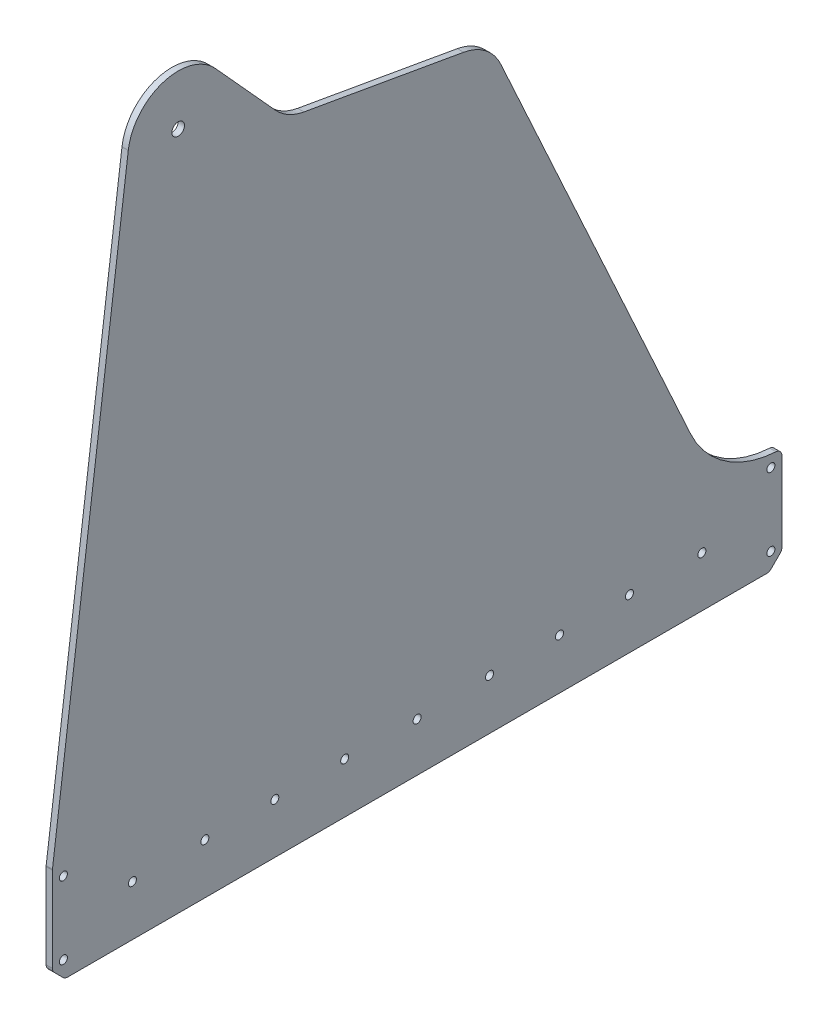
ISO-10303-21;
HEADER;
FILE_DESCRIPTION(('STEP AP214'),'2;1');
FILE_NAME('part.step','',(''),(''),'','','');
FILE_SCHEMA(('AUTOMOTIVE_DESIGN { 1 0 10303 214 1 1 1 1 }'));
ENDSEC;
DATA;
#1=APPLICATION_CONTEXT('core data for automotive mechanical design processes');
#2=APPLICATION_PROTOCOL_DEFINITION('international standard','automotive_design',2000,#1);
#3=PRODUCT_CONTEXT('',#1,'mechanical');
#4=PRODUCT('Part','Part','',(#3));
#5=PRODUCT_RELATED_PRODUCT_CATEGORY('part','',(#4));
#6=PRODUCT_DEFINITION_FORMATION('','',#4);
#7=PRODUCT_DEFINITION_CONTEXT('part definition',#1,'design');
#8=PRODUCT_DEFINITION('design','',#6,#7);
#9=PRODUCT_DEFINITION_SHAPE('','',#8);
#10=(LENGTH_UNIT() NAMED_UNIT(*) SI_UNIT(.MILLI.,.METRE.));
#11=(NAMED_UNIT(*) PLANE_ANGLE_UNIT() SI_UNIT($,.RADIAN.));
#12=(NAMED_UNIT(*) SI_UNIT($,.STERADIAN.) SOLID_ANGLE_UNIT());
#13=UNCERTAINTY_MEASURE_WITH_UNIT(LENGTH_MEASURE(1.E-05),#10,'distance_accuracy_value','');
#14=(GEOMETRIC_REPRESENTATION_CONTEXT(3) GLOBAL_UNCERTAINTY_ASSIGNED_CONTEXT((#13)) GLOBAL_UNIT_ASSIGNED_CONTEXT((#10,
#11,#12)) REPRESENTATION_CONTEXT('',''));
#15=CARTESIAN_POINT('',(0.,0.,0.));
#16=DIRECTION('',(0.,0.,1.));
#17=DIRECTION('',(1.,0.,0.));
#18=AXIS2_PLACEMENT_3D('',#15,#16,#17);
#19=CARTESIAN_POINT('',(0.,342.9,-63.4999999999999));
#20=DIRECTION('',(-1.,0.,0.));
#21=DIRECTION('',(0.,0.,1.));
#22=AXIS2_PLACEMENT_3D('',#19,#20,#21);
#23=PLANE('',#22);
#24=CARTESIAN_POINT('',(0.,45.24375,-5.55625));
#25=DIRECTION('',(1.,0.,0.));
#26=DIRECTION('',(0.,0.,-1.));
#27=AXIS2_PLACEMENT_3D('',#24,#25,#26);
#28=CIRCLE('',#27,2.03199999999999);
#29=CARTESIAN_POINT('',(0.,45.24375,-7.58824999999999));
#30=VERTEX_POINT('',#29);
#31=EDGE_CURVE('E421',#30,#30,#28,.T.);
#32=ORIENTED_EDGE('',*,*,#31,.T.);
#33=EDGE_LOOP('',(#32));
#34=FACE_BOUND('',#33,.T.);
#35=CARTESIAN_POINT('',(0.,8.65147410593553,-5.55625));
#36=DIRECTION('',(1.,0.,0.));
#37=DIRECTION('',(0.,0.,-1.));
#38=AXIS2_PLACEMENT_3D('',#35,#36,#37);
#39=CIRCLE('',#38,2.03199999999999);
#40=CARTESIAN_POINT('',(0.,8.65147410593553,-7.58824999999999));
#41=VERTEX_POINT('',#40);
#42=EDGE_CURVE('E415',#41,#41,#39,.T.);
#43=ORIENTED_EDGE('',*,*,#42,.T.);
#44=EDGE_LOOP('',(#43));
#45=FACE_BOUND('',#44,.T.);
#46=CARTESIAN_POINT('',(0.,25.4,-220.717386247003));
#47=DIRECTION('',(1.,0.,0.));
#48=DIRECTION('',(0.,0.,-1.));
#49=AXIS2_PLACEMENT_3D('',#46,#47,#48);
#50=CIRCLE('',#49,2.032);
#51=CARTESIAN_POINT('',(0.,25.4,-222.749386247003));
#52=VERTEX_POINT('',#51);
#53=EDGE_CURVE('E381',#52,#52,#50,.T.);
#54=ORIENTED_EDGE('',*,*,#53,.T.);
#55=EDGE_LOOP('',(#54));
#56=FACE_BOUND('',#55,.T.);
#57=CARTESIAN_POINT('',(0.,25.4,-256.023386247003));
#58=DIRECTION('',(1.,0.,0.));
#59=DIRECTION('',(0.,0.,-1.));
#60=AXIS2_PLACEMENT_3D('',#57,#58,#59);
#61=CIRCLE('',#60,2.032);
#62=CARTESIAN_POINT('',(0.,25.4,-258.055386247003));
#63=VERTEX_POINT('',#62);
#64=EDGE_CURVE('E375',#63,#63,#61,.T.);
#65=ORIENTED_EDGE('',*,*,#64,.T.);
#66=EDGE_LOOP('',(#65));
#67=FACE_BOUND('',#66,.T.);
#68=CARTESIAN_POINT('',(0.,25.4,-291.329386247003));
#69=DIRECTION('',(1.,0.,0.));
#70=DIRECTION('',(0.,0.,-1.));
#71=AXIS2_PLACEMENT_3D('',#68,#69,#70);
#72=CIRCLE('',#71,2.032);
#73=CARTESIAN_POINT('',(0.,25.4,-293.361386247003));
#74=VERTEX_POINT('',#73);
#75=EDGE_CURVE('E369',#74,#74,#72,.T.);
#76=ORIENTED_EDGE('',*,*,#75,.T.);
#77=EDGE_LOOP('',(#76));
#78=FACE_BOUND('',#77,.T.);
#79=CARTESIAN_POINT('',(0.,25.4,-327.905386247003));
#80=DIRECTION('',(1.,0.,0.));
#81=DIRECTION('',(0.,0.,-1.));
#82=AXIS2_PLACEMENT_3D('',#79,#80,#81);
#83=CIRCLE('',#82,2.032);
#84=CARTESIAN_POINT('',(0.,25.4,-329.937386247003));
#85=VERTEX_POINT('',#84);
#86=EDGE_CURVE('E363',#85,#85,#83,.T.);
#87=ORIENTED_EDGE('',*,*,#86,.T.);
#88=EDGE_LOOP('',(#87));
#89=FACE_BOUND('',#88,.T.);
#90=CARTESIAN_POINT('',(0.,25.4,-147.582613752997));
#91=DIRECTION('',(1.,0.,0.));
#92=DIRECTION('',(0.,0.,-1.));
#93=AXIS2_PLACEMENT_3D('',#90,#91,#92);
#94=CIRCLE('',#93,2.032);
#95=CARTESIAN_POINT('',(0.,25.4,-149.614613752997));
#96=VERTEX_POINT('',#95);
#97=EDGE_CURVE('E355',#96,#96,#94,.T.);
#98=ORIENTED_EDGE('',*,*,#97,.T.);
#99=EDGE_LOOP('',(#98));
#100=FACE_BOUND('',#99,.T.);
#101=CARTESIAN_POINT('',(0.,25.4,-112.276613752997));
#102=DIRECTION('',(1.,0.,0.));
#103=DIRECTION('',(0.,0.,-1.));
#104=AXIS2_PLACEMENT_3D('',#101,#102,#103);
#105=CIRCLE('',#104,2.032);
#106=CARTESIAN_POINT('',(0.,25.4,-114.308613752997));
#107=VERTEX_POINT('',#106);
#108=EDGE_CURVE('E349',#107,#107,#105,.T.);
#109=ORIENTED_EDGE('',*,*,#108,.T.);
#110=EDGE_LOOP('',(#109));
#111=FACE_BOUND('',#110,.T.);
#112=CARTESIAN_POINT('',(0.,25.4,-76.970613752997));
#113=DIRECTION('',(1.,0.,0.));
#114=DIRECTION('',(0.,0.,-1.));
#115=AXIS2_PLACEMENT_3D('',#112,#113,#114);
#116=CIRCLE('',#115,2.032);
#117=CARTESIAN_POINT('',(0.,25.4,-79.002613752997));
#118=VERTEX_POINT('',#117);
#119=EDGE_CURVE('E343',#118,#118,#116,.T.);
#120=ORIENTED_EDGE('',*,*,#119,.T.);
#121=EDGE_LOOP('',(#120));
#122=FACE_BOUND('',#121,.T.);
#123=CARTESIAN_POINT('',(0.,25.4,-40.394613752997));
#124=DIRECTION('',(1.,0.,0.));
#125=DIRECTION('',(0.,0.,-1.));
#126=AXIS2_PLACEMENT_3D('',#123,#124,#125);
#127=CIRCLE('',#126,2.032);
#128=CARTESIAN_POINT('',(0.,25.4,-42.426613752997));
#129=VERTEX_POINT('',#128);
#130=EDGE_CURVE('E228',#129,#129,#127,.T.);
#131=ORIENTED_EDGE('',*,*,#130,.T.);
#132=EDGE_LOOP('',(#131));
#133=FACE_BOUND('',#132,.T.);
#134=DIRECTION('',(0.,-1.,0.));
#135=VECTOR('',#134,1.);
#136=CARTESIAN_POINT('',(0.,0.,0.));
#137=LINE('',#136,#135);
#138=CARTESIAN_POINT('',(0.,50.5949499732576,0.));
#139=VERTEX_POINT('',#138);
#140=CARTESIAN_POINT('',(0.,7.66512806053459,0.));
#141=VERTEX_POINT('',#140);
#142=EDGE_CURVE('E247',#139,#141,#137,.T.);
#143=ORIENTED_EDGE('',*,*,#142,.F.);
#144=CARTESIAN_POINT('',(0.,50.5949499732576,-3.175));
#145=DIRECTION('',(-1.,0.,0.));
#146=DIRECTION('',(0.,0.,1.));
#147=AXIS2_PLACEMENT_3D('',#144,#145,#146);
#148=CIRCLE('',#147,3.175);
#149=CARTESIAN_POINT('',(0.,51.0033466355969,-0.0263753532391168));
#150=VERTEX_POINT('',#149);
#151=EDGE_CURVE('E292',#139,#150,#148,.T.);
#152=ORIENTED_EDGE('',*,*,#151,.T.);
#153=DIRECTION('',(0.,-0.991692802129412,0.128628870028133));
#154=VECTOR('',#153,1.);
#155=CARTESIAN_POINT('',(0.,50.8,0.));
#156=LINE('',#155,#154);
#157=CARTESIAN_POINT('',(0.,346.167173298714,-38.3110028259128));
#158=VERTEX_POINT('',#157);
#159=EDGE_CURVE('E244',#158,#150,#156,.T.);
#160=ORIENTED_EDGE('',*,*,#159,.F.);
#161=CARTESIAN_POINT('',(0.,342.9,-63.4999999999999));
#162=DIRECTION('',(1.,0.,0.));
#163=DIRECTION('',(0.,0.,1.));
#164=AXIS2_PLACEMENT_3D('',#161,#162,#163);
#165=CIRCLE('',#164,25.4);
#166=CARTESIAN_POINT('',(0.,359.964622930193,-82.3137886734786));
#167=VERTEX_POINT('',#166);
#168=EDGE_CURVE('E242',#167,#158,#165,.T.);
#169=ORIENTED_EDGE('',*,*,#168,.F.);
#170=DIRECTION('',(0.,0.74070034147554,0.671835548432813));
#171=VECTOR('',#170,1.);
#172=CARTESIAN_POINT('',(0.,359.964622930193,-82.3137886734786));
#173=LINE('',#172,#171);
#174=CARTESIAN_POINT('',(0.,326.577445868199,-112.596875039261));
#175=VERTEX_POINT('',#174);
#176=EDGE_CURVE('E240',#175,#167,#173,.T.);
#177=ORIENTED_EDGE('',*,*,#176,.F.);
#178=CARTESIAN_POINT('',(0.,343.642068798392,-131.41066371274));
#179=DIRECTION('',(-1.,0.,0.));
#180=DIRECTION('',(0.,0.,-1.));
#181=AXIS2_PLACEMENT_3D('',#178,#179,#180);
#182=CIRCLE('',#181,25.4);
#183=CARTESIAN_POINT('',(0.,318.627951871882,-127.));
#184=VERTEX_POINT('',#183);
#185=EDGE_CURVE('E238',#184,#175,#182,.T.);
#186=ORIENTED_EDGE('',*,*,#185,.F.);
#187=DIRECTION('',(0.,0.173648177666924,0.984807753012209));
#188=VECTOR('',#187,1.);
#189=CARTESIAN_POINT('',(0.,318.627951871882,-127.));
#190=LINE('',#189,#188);
#191=CARTESIAN_POINT('',(0.,304.41411692651,-207.61066371274));
#192=VERTEX_POINT('',#191);
#193=EDGE_CURVE('E236',#192,#184,#190,.T.);
#194=ORIENTED_EDGE('',*,*,#193,.F.);
#195=CARTESIAN_POINT('',(0.,279.4,-203.2));
#196=DIRECTION('',(1.,0.,0.));
#197=DIRECTION('',(0.,0.,1.));
#198=AXIS2_PLACEMENT_3D('',#195,#196,#197);
#199=CIRCLE('',#198,25.4);
#200=CARTESIAN_POINT('',(0.,289.96352200003,-226.299177538494));
#201=VERTEX_POINT('',#200);
#202=EDGE_CURVE('E234',#201,#192,#199,.T.);
#203=ORIENTED_EDGE('',*,*,#202,.F.);
#204=DIRECTION('',(0.,0.909416438523394,0.41588669291458));
#205=VECTOR('',#204,1.);
#206=CARTESIAN_POINT('',(0.,289.96352200003,-226.299177538494));
#207=LINE('',#206,#205);
#208=CARTESIAN_POINT('',(0.,80.4729559999393,-322.101644923012));
#209=VERTEX_POINT('',#208);
#210=EDGE_CURVE('E232',#209,#201,#207,.T.);
#211=ORIENTED_EDGE('',*,*,#210,.F.);
#212=CARTESIAN_POINT('',(0.,101.6,-368.3));
#213=DIRECTION('',(-1.,0.,0.));
#214=DIRECTION('',(0.,0.,-1.));
#215=AXIS2_PLACEMENT_3D('',#212,#213,#214);
#216=CIRCLE('',#215,50.8);
#217=CARTESIAN_POINT('',(0.,50.8879654339624,-365.311764705882));
#218=VERTEX_POINT('',#217);
#219=EDGE_CURVE('E194',#218,#209,#216,.T.);
#220=ORIENTED_EDGE('',*,*,#219,.F.);
#221=CARTESIAN_POINT('',(0.,47.7184632735851,-365.125));
#222=DIRECTION('',(-1.,0.,0.));
#223=DIRECTION('',(0.,0.,1.));
#224=AXIS2_PLACEMENT_3D('',#221,#222,#223);
#225=CIRCLE('',#224,3.175);
#226=CARTESIAN_POINT('',(0.,47.7184632735851,-368.3));
#227=VERTEX_POINT('',#226);
#228=EDGE_CURVE('E282',#218,#227,#225,.T.);
#229=ORIENTED_EDGE('',*,*,#228,.T.);
#230=DIRECTION('',(0.,1.,0.));
#231=VECTOR('',#230,1.);
#232=CARTESIAN_POINT('',(0.,50.8,-368.3));
#233=LINE('',#232,#231);
#234=CARTESIAN_POINT('',(0.,7.66512806053454,-368.3));
#235=VERTEX_POINT('',#234);
#236=EDGE_CURVE('E227',#235,#227,#233,.T.);
#237=ORIENTED_EDGE('',*,*,#236,.F.);
#238=CARTESIAN_POINT('',(0.,7.66512806053454,-365.125));
#239=DIRECTION('',(-1.,0.,0.));
#240=DIRECTION('',(0.,0.,1.));
#241=AXIS2_PLACEMENT_3D('',#238,#239,#240);
#242=CIRCLE('',#241,3.175);
#243=CARTESIAN_POINT('',(0.,5.42006403026726,-367.370064030267));
#244=VERTEX_POINT('',#243);
#245=EDGE_CURVE('E284',#235,#244,#242,.T.);
#246=ORIENTED_EDGE('',*,*,#245,.T.);
#247=DIRECTION('',(0.,0.707106781186544,-0.707106781186551));
#248=VECTOR('',#247,1.);
#249=CARTESIAN_POINT('',(0.,22.2249999999984,-384.174999999999));
#250=LINE('',#249,#248);
#251=CARTESIAN_POINT('',(0.,0.929935969732735,-362.879935969733));
#252=VERTEX_POINT('',#251);
#253=EDGE_CURVE('E268',#244,#252,#250,.F.);
#254=ORIENTED_EDGE('',*,*,#253,.T.);
#255=CARTESIAN_POINT('',(0.,3.175,-360.634871939465));
#256=DIRECTION('',(-1.,0.,0.));
#257=DIRECTION('',(0.,0.,1.));
#258=AXIS2_PLACEMENT_3D('',#255,#256,#257);
#259=CIRCLE('',#258,3.175);
#260=CARTESIAN_POINT('',(0.,0.,-360.634871939465));
#261=VERTEX_POINT('',#260);
#262=EDGE_CURVE('E286',#252,#261,#259,.T.);
#263=ORIENTED_EDGE('',*,*,#262,.T.);
#264=DIRECTION('',(0.,0.,-1.));
#265=VECTOR('',#264,1.);
#266=CARTESIAN_POINT('',(0.,0.,-368.3));
#267=LINE('',#266,#265);
#268=CARTESIAN_POINT('',(0.,0.,-7.66512806053454));
#269=VERTEX_POINT('',#268);
#270=EDGE_CURVE('E223',#269,#261,#267,.T.);
#271=ORIENTED_EDGE('',*,*,#270,.F.);
#272=CARTESIAN_POINT('',(0.,3.175,-7.66512806053454));
#273=DIRECTION('',(-1.,0.,0.));
#274=DIRECTION('',(0.,0.,1.));
#275=AXIS2_PLACEMENT_3D('',#272,#273,#274);
#276=CIRCLE('',#275,3.175);
#277=CARTESIAN_POINT('',(0.,0.929935969732731,-5.42006403026726));
#278=VERTEX_POINT('',#277);
#279=EDGE_CURVE('E290',#269,#278,#276,.T.);
#280=ORIENTED_EDGE('',*,*,#279,.T.);
#281=DIRECTION('',(0.,-0.707106781186551,-0.707106781186544));
#282=VECTOR('',#281,1.);
#283=CARTESIAN_POINT('',(0.,142.875000000002,136.525));
#284=LINE('',#283,#282);
#285=CARTESIAN_POINT('',(0.,5.42006403026732,-0.929935969732731));
#286=VERTEX_POINT('',#285);
#287=EDGE_CURVE('E197',#278,#286,#284,.F.);
#288=ORIENTED_EDGE('',*,*,#287,.T.);
#289=CARTESIAN_POINT('',(0.,7.66512806053459,-3.175));
#290=DIRECTION('',(-1.,0.,0.));
#291=DIRECTION('',(0.,0.,1.));
#292=AXIS2_PLACEMENT_3D('',#289,#290,#291);
#293=CIRCLE('',#292,3.175);
#294=EDGE_CURVE('E288',#286,#141,#293,.T.);
#295=ORIENTED_EDGE('',*,*,#294,.T.);
#296=EDGE_LOOP('',(#143,#152,#160,#169,#177,#186,#194,#203,#211,#220,#229,#237,#246,#254,#263,
#271,#280,#288,#295));
#297=FACE_BOUND('',#296,.T.);
#298=CARTESIAN_POINT('',(0.,24.60625,-184.15));
#299=DIRECTION('',(1.,0.,0.));
#300=DIRECTION('',(0.,0.,-1.));
#301=AXIS2_PLACEMENT_3D('',#298,#299,#300);
#302=CIRCLE('',#301,2.032);
#303=CARTESIAN_POINT('',(0.,24.60625,-186.182));
#304=VERTEX_POINT('',#303);
#305=EDGE_CURVE('E389',#304,#304,#302,.T.);
#306=ORIENTED_EDGE('',*,*,#305,.T.);
#307=EDGE_LOOP('',(#306));
#308=FACE_BOUND('',#307,.T.);
#309=CARTESIAN_POINT('',(0.,342.9,-63.4999999999999));
#310=DIRECTION('',(1.,0.,0.));
#311=DIRECTION('',(0.,0.,-1.));
#312=AXIS2_PLACEMENT_3D('',#309,#310,#311);
#313=CIRCLE('',#312,3.175);
#314=CARTESIAN_POINT('',(0.,342.9,-66.6749999999999));
#315=VERTEX_POINT('',#314);
#316=EDGE_CURVE('E397',#315,#315,#313,.T.);
#317=ORIENTED_EDGE('',*,*,#316,.T.);
#318=EDGE_LOOP('',(#317));
#319=FACE_BOUND('',#318,.T.);
#320=CARTESIAN_POINT('',(0.,8.65147410593553,-362.74375));
#321=DIRECTION('',(1.,0.,0.));
#322=DIRECTION('',(0.,0.,-1.));
#323=AXIS2_PLACEMENT_3D('',#320,#321,#322);
#324=CIRCLE('',#323,2.03199999999999);
#325=CARTESIAN_POINT('',(0.,8.65147410593553,-364.77575));
#326=VERTEX_POINT('',#325);
#327=EDGE_CURVE('E401',#326,#326,#324,.T.);
#328=ORIENTED_EDGE('',*,*,#327,.T.);
#329=EDGE_LOOP('',(#328));
#330=FACE_BOUND('',#329,.T.);
#331=CARTESIAN_POINT('',(0.,45.24375,-362.74375));
#332=DIRECTION('',(1.,0.,0.));
#333=DIRECTION('',(0.,0.,-1.));
#334=AXIS2_PLACEMENT_3D('',#331,#332,#333);
#335=CIRCLE('',#334,2.03199999999999);
#336=CARTESIAN_POINT('',(0.,45.24375,-364.77575));
#337=VERTEX_POINT('',#336);
#338=EDGE_CURVE('E409',#337,#337,#335,.T.);
#339=ORIENTED_EDGE('',*,*,#338,.T.);
#340=EDGE_LOOP('',(#339));
#341=FACE_BOUND('',#340,.T.);
#342=ADVANCED_FACE('F45',(#34,#45,#56,#67,#78,#89,#100,#111,#122,#133,#297,#308,#319,#330,#341),
#23,.T.);
#343=CARTESIAN_POINT('',(3.175,342.9,-63.4999999999999));
#344=DIRECTION('',(-1.,0.,0.));
#345=DIRECTION('',(0.,0.,1.));
#346=AXIS2_PLACEMENT_3D('',#343,#344,#345);
#347=PLANE('',#346);
#348=CARTESIAN_POINT('',(3.175,45.24375,-5.55625));
#349=DIRECTION('',(1.,0.,0.));
#350=DIRECTION('',(0.,0.,-1.));
#351=AXIS2_PLACEMENT_3D('',#348,#349,#350);
#352=CIRCLE('',#351,2.03199999999999);
#353=CARTESIAN_POINT('',(3.175,45.24375,-7.58824999999999));
#354=VERTEX_POINT('',#353);
#355=EDGE_CURVE('E424',#354,#354,#352,.T.);
#356=ORIENTED_EDGE('',*,*,#355,.F.);
#357=EDGE_LOOP('',(#356));
#358=FACE_BOUND('',#357,.T.);
#359=CARTESIAN_POINT('',(3.175,8.65147410593553,-5.55625));
#360=DIRECTION('',(1.,0.,0.));
#361=DIRECTION('',(0.,0.,-1.));
#362=AXIS2_PLACEMENT_3D('',#359,#360,#361);
#363=CIRCLE('',#362,2.03199999999999);
#364=CARTESIAN_POINT('',(3.175,8.65147410593553,-7.58824999999999));
#365=VERTEX_POINT('',#364);
#366=EDGE_CURVE('E418',#365,#365,#363,.T.);
#367=ORIENTED_EDGE('',*,*,#366,.F.);
#368=EDGE_LOOP('',(#367));
#369=FACE_BOUND('',#368,.T.);
#370=CARTESIAN_POINT('',(3.175,45.24375,-362.74375));
#371=DIRECTION('',(1.,0.,0.));
#372=DIRECTION('',(0.,0.,-1.));
#373=AXIS2_PLACEMENT_3D('',#370,#371,#372);
#374=CIRCLE('',#373,2.03199999999999);
#375=CARTESIAN_POINT('',(3.175,45.24375,-364.77575));
#376=VERTEX_POINT('',#375);
#377=EDGE_CURVE('E412',#376,#376,#374,.T.);
#378=ORIENTED_EDGE('',*,*,#377,.F.);
#379=EDGE_LOOP('',(#378));
#380=FACE_BOUND('',#379,.T.);
#381=CARTESIAN_POINT('',(3.175,8.65147410593553,-362.74375));
#382=DIRECTION('',(1.,0.,0.));
#383=DIRECTION('',(0.,0.,-1.));
#384=AXIS2_PLACEMENT_3D('',#381,#382,#383);
#385=CIRCLE('',#384,2.03199999999999);
#386=CARTESIAN_POINT('',(3.175,8.65147410593553,-364.77575));
#387=VERTEX_POINT('',#386);
#388=EDGE_CURVE('E406',#387,#387,#385,.T.);
#389=ORIENTED_EDGE('',*,*,#388,.F.);
#390=EDGE_LOOP('',(#389));
#391=FACE_BOUND('',#390,.T.);
#392=CARTESIAN_POINT('',(3.175,342.9,-63.4999999999999));
#393=DIRECTION('',(1.,0.,0.));
#394=DIRECTION('',(0.,0.,-1.));
#395=AXIS2_PLACEMENT_3D('',#392,#393,#394);
#396=CIRCLE('',#395,3.175);
#397=CARTESIAN_POINT('',(3.175,342.9,-66.6749999999999));
#398=VERTEX_POINT('',#397);
#399=EDGE_CURVE('E398',#398,#398,#396,.T.);
#400=ORIENTED_EDGE('',*,*,#399,.F.);
#401=EDGE_LOOP('',(#400));
#402=FACE_BOUND('',#401,.T.);
#403=CARTESIAN_POINT('',(3.175,24.60625,-184.15));
#404=DIRECTION('',(1.,0.,0.));
#405=DIRECTION('',(0.,0.,-1.));
#406=AXIS2_PLACEMENT_3D('',#403,#404,#405);
#407=CIRCLE('',#406,2.032);
#408=CARTESIAN_POINT('',(3.175,24.60625,-186.182));
#409=VERTEX_POINT('',#408);
#410=EDGE_CURVE('E393',#409,#409,#407,.T.);
#411=ORIENTED_EDGE('',*,*,#410,.F.);
#412=EDGE_LOOP('',(#411));
#413=FACE_BOUND('',#412,.T.);
#414=CARTESIAN_POINT('',(3.175,25.4,-220.717386247003));
#415=DIRECTION('',(1.,0.,0.));
#416=DIRECTION('',(0.,0.,-1.));
#417=AXIS2_PLACEMENT_3D('',#414,#415,#416);
#418=CIRCLE('',#417,2.032);
#419=CARTESIAN_POINT('',(3.175,25.4,-222.749386247003));
#420=VERTEX_POINT('',#419);
#421=EDGE_CURVE('E385',#420,#420,#418,.T.);
#422=ORIENTED_EDGE('',*,*,#421,.F.);
#423=EDGE_LOOP('',(#422));
#424=FACE_BOUND('',#423,.T.);
#425=CARTESIAN_POINT('',(3.175,25.4,-291.329386247003));
#426=DIRECTION('',(1.,0.,0.));
#427=DIRECTION('',(0.,0.,-1.));
#428=AXIS2_PLACEMENT_3D('',#425,#426,#427);
#429=CIRCLE('',#428,2.032);
#430=CARTESIAN_POINT('',(3.175,25.4,-293.361386247003));
#431=VERTEX_POINT('',#430);
#432=EDGE_CURVE('E372',#431,#431,#429,.T.);
#433=ORIENTED_EDGE('',*,*,#432,.F.);
#434=EDGE_LOOP('',(#433));
#435=FACE_BOUND('',#434,.T.);
#436=CARTESIAN_POINT('',(3.175,25.4,-327.905386247003));
#437=DIRECTION('',(1.,0.,0.));
#438=DIRECTION('',(0.,0.,-1.));
#439=AXIS2_PLACEMENT_3D('',#436,#437,#438);
#440=CIRCLE('',#439,2.032);
#441=CARTESIAN_POINT('',(3.175,25.4,-329.937386247003));
#442=VERTEX_POINT('',#441);
#443=EDGE_CURVE('E366',#442,#442,#440,.T.);
#444=ORIENTED_EDGE('',*,*,#443,.F.);
#445=EDGE_LOOP('',(#444));
#446=FACE_BOUND('',#445,.T.);
#447=CARTESIAN_POINT('',(3.175,25.4,-112.276613752997));
#448=DIRECTION('',(1.,0.,0.));
#449=DIRECTION('',(0.,0.,-1.));
#450=AXIS2_PLACEMENT_3D('',#447,#448,#449);
#451=CIRCLE('',#450,2.032);
#452=CARTESIAN_POINT('',(3.175,25.4,-114.308613752997));
#453=VERTEX_POINT('',#452);
#454=EDGE_CURVE('E352',#453,#453,#451,.T.);
#455=ORIENTED_EDGE('',*,*,#454,.F.);
#456=EDGE_LOOP('',(#455));
#457=FACE_BOUND('',#456,.T.);
#458=CARTESIAN_POINT('',(3.175,25.4,-76.970613752997));
#459=DIRECTION('',(1.,0.,0.));
#460=DIRECTION('',(0.,0.,-1.));
#461=AXIS2_PLACEMENT_3D('',#458,#459,#460);
#462=CIRCLE('',#461,2.032);
#463=CARTESIAN_POINT('',(3.175,25.4,-79.002613752997));
#464=VERTEX_POINT('',#463);
#465=EDGE_CURVE('E346',#464,#464,#462,.T.);
#466=ORIENTED_EDGE('',*,*,#465,.F.);
#467=EDGE_LOOP('',(#466));
#468=FACE_BOUND('',#467,.T.);
#469=DIRECTION('',(0.,-0.991692802129412,0.128628870028133));
#470=VECTOR('',#469,1.);
#471=CARTESIAN_POINT('',(3.175,50.8,0.));
#472=LINE('',#471,#470);
#473=CARTESIAN_POINT('',(3.175,346.167173298714,-38.3110028259128));
#474=VERTEX_POINT('',#473);
#475=CARTESIAN_POINT('',(3.175,51.0033466355969,-0.0263753532391168));
#476=VERTEX_POINT('',#475);
#477=EDGE_CURVE('E218',#474,#476,#472,.T.);
#478=ORIENTED_EDGE('',*,*,#477,.T.);
#479=CARTESIAN_POINT('',(3.175,50.5949499732576,-3.175));
#480=DIRECTION('',(-1.,0.,0.));
#481=DIRECTION('',(0.,0.,1.));
#482=AXIS2_PLACEMENT_3D('',#479,#480,#481);
#483=CIRCLE('',#482,3.175);
#484=CARTESIAN_POINT('',(3.175,50.5949499732576,0.));
#485=VERTEX_POINT('',#484);
#486=EDGE_CURVE('E304',#476,#485,#483,.F.);
#487=ORIENTED_EDGE('',*,*,#486,.T.);
#488=DIRECTION('',(0.,-1.,0.));
#489=VECTOR('',#488,1.);
#490=CARTESIAN_POINT('',(3.175,0.,0.));
#491=LINE('',#490,#489);
#492=CARTESIAN_POINT('',(3.175,7.66512806053459,0.));
#493=VERTEX_POINT('',#492);
#494=EDGE_CURVE('E220',#485,#493,#491,.T.);
#495=ORIENTED_EDGE('',*,*,#494,.T.);
#496=CARTESIAN_POINT('',(3.175,7.66512806053459,-3.175));
#497=DIRECTION('',(-1.,0.,0.));
#498=DIRECTION('',(0.,0.,1.));
#499=AXIS2_PLACEMENT_3D('',#496,#497,#498);
#500=CIRCLE('',#499,3.175);
#501=CARTESIAN_POINT('',(3.175,5.42006403026731,-0.929935969732701));
#502=VERTEX_POINT('',#501);
#503=EDGE_CURVE('E67',#493,#502,#500,.F.);
#504=ORIENTED_EDGE('',*,*,#503,.T.);
#505=DIRECTION('',(0.,0.707106781186551,0.707106781186544));
#506=VECTOR('',#505,1.);
#507=CARTESIAN_POINT('',(3.175,0.,-6.34999999999997));
#508=LINE('',#507,#506);
#509=CARTESIAN_POINT('',(3.175,0.929935969732726,-5.42006403026725));
#510=VERTEX_POINT('',#509);
#511=EDGE_CURVE('E271',#502,#510,#508,.F.);
#512=ORIENTED_EDGE('',*,*,#511,.T.);
#513=CARTESIAN_POINT('',(3.175,3.175,-7.66512806053454));
#514=DIRECTION('',(-1.,0.,0.));
#515=DIRECTION('',(0.,0.,1.));
#516=AXIS2_PLACEMENT_3D('',#513,#514,#515);
#517=CIRCLE('',#516,3.175);
#518=CARTESIAN_POINT('',(3.175,0.,-7.66512806053454));
#519=VERTEX_POINT('',#518);
#520=EDGE_CURVE('E302',#510,#519,#517,.F.);
#521=ORIENTED_EDGE('',*,*,#520,.T.);
#522=DIRECTION('',(0.,0.,-1.));
#523=VECTOR('',#522,1.);
#524=CARTESIAN_POINT('',(3.175,0.,-368.3));
#525=LINE('',#524,#523);
#526=CARTESIAN_POINT('',(3.175,0.,-360.634871939465));
#527=VERTEX_POINT('',#526);
#528=EDGE_CURVE('E250',#519,#527,#525,.T.);
#529=ORIENTED_EDGE('',*,*,#528,.T.);
#530=CARTESIAN_POINT('',(3.175,3.175,-360.634871939465));
#531=DIRECTION('',(-1.,0.,0.));
#532=DIRECTION('',(0.,0.,1.));
#533=AXIS2_PLACEMENT_3D('',#530,#531,#532);
#534=CIRCLE('',#533,3.175);
#535=CARTESIAN_POINT('',(3.175,0.929935969732724,-362.879935969733));
#536=VERTEX_POINT('',#535);
#537=EDGE_CURVE('E299',#527,#536,#534,.F.);
#538=ORIENTED_EDGE('',*,*,#537,.T.);
#539=DIRECTION('',(0.,-0.707106781186544,0.707106781186551));
#540=VECTOR('',#539,1.);
#541=CARTESIAN_POINT('',(3.175,6.34999999999997,-368.3));
#542=LINE('',#541,#540);
#543=CARTESIAN_POINT('',(3.175,5.42006403026725,-367.370064030267));
#544=VERTEX_POINT('',#543);
#545=EDGE_CURVE('E273',#536,#544,#542,.F.);
#546=ORIENTED_EDGE('',*,*,#545,.T.);
#547=CARTESIAN_POINT('',(3.175,7.66512806053454,-365.125));
#548=DIRECTION('',(-1.,0.,0.));
#549=DIRECTION('',(0.,0.,1.));
#550=AXIS2_PLACEMENT_3D('',#547,#548,#549);
#551=CIRCLE('',#550,3.175);
#552=CARTESIAN_POINT('',(3.175,7.66512806053454,-368.3));
#553=VERTEX_POINT('',#552);
#554=EDGE_CURVE('E297',#544,#553,#551,.F.);
#555=ORIENTED_EDGE('',*,*,#554,.T.);
#556=DIRECTION('',(0.,1.,0.));
#557=VECTOR('',#556,1.);
#558=CARTESIAN_POINT('',(3.175,50.8,-368.3));
#559=LINE('',#558,#557);
#560=CARTESIAN_POINT('',(3.175,47.7184632735851,-368.3));
#561=VERTEX_POINT('',#560);
#562=EDGE_CURVE('E188',#553,#561,#559,.T.);
#563=ORIENTED_EDGE('',*,*,#562,.T.);
#564=CARTESIAN_POINT('',(3.175,47.7184632735851,-365.125));
#565=DIRECTION('',(-1.,0.,0.));
#566=DIRECTION('',(0.,0.,1.));
#567=AXIS2_PLACEMENT_3D('',#564,#565,#566);
#568=CIRCLE('',#567,3.175);
#569=CARTESIAN_POINT('',(3.175,50.8879654339624,-365.311764705882));
#570=VERTEX_POINT('',#569);
#571=EDGE_CURVE('E185',#561,#570,#568,.F.);
#572=ORIENTED_EDGE('',*,*,#571,.T.);
#573=CARTESIAN_POINT('',(3.175,101.6,-368.3));
#574=DIRECTION('',(-1.,0.,0.));
#575=DIRECTION('',(0.,0.,-1.));
#576=AXIS2_PLACEMENT_3D('',#573,#574,#575);
#577=CIRCLE('',#576,50.8);
#578=CARTESIAN_POINT('',(3.175,80.4729559999393,-322.101644923012));
#579=VERTEX_POINT('',#578);
#580=EDGE_CURVE('E175',#570,#579,#577,.T.);
#581=ORIENTED_EDGE('',*,*,#580,.T.);
#582=DIRECTION('',(0.,0.909416438523394,0.41588669291458));
#583=VECTOR('',#582,1.);
#584=CARTESIAN_POINT('',(3.175,289.96352200003,-226.299177538494));
#585=LINE('',#584,#583);
#586=CARTESIAN_POINT('',(3.175,289.96352200003,-226.299177538494));
#587=VERTEX_POINT('',#586);
#588=EDGE_CURVE('E181',#579,#587,#585,.T.);
#589=ORIENTED_EDGE('',*,*,#588,.T.);
#590=CARTESIAN_POINT('',(3.175,279.4,-203.2));
#591=DIRECTION('',(1.,0.,0.));
#592=DIRECTION('',(0.,0.,1.));
#593=AXIS2_PLACEMENT_3D('',#590,#591,#592);
#594=CIRCLE('',#593,25.4);
#595=CARTESIAN_POINT('',(3.175,304.41411692651,-207.61066371274));
#596=VERTEX_POINT('',#595);
#597=EDGE_CURVE('E204',#587,#596,#594,.T.);
#598=ORIENTED_EDGE('',*,*,#597,.T.);
#599=DIRECTION('',(0.,0.173648177666924,0.984807753012209));
#600=VECTOR('',#599,1.);
#601=CARTESIAN_POINT('',(3.175,318.627951871882,-127.));
#602=LINE('',#601,#600);
#603=CARTESIAN_POINT('',(3.175,318.627951871882,-127.));
#604=VERTEX_POINT('',#603);
#605=EDGE_CURVE('E207',#596,#604,#602,.T.);
#606=ORIENTED_EDGE('',*,*,#605,.T.);
#607=CARTESIAN_POINT('',(3.175,343.642068798392,-131.41066371274));
#608=DIRECTION('',(-1.,0.,0.));
#609=DIRECTION('',(0.,0.,-1.));
#610=AXIS2_PLACEMENT_3D('',#607,#608,#609);
#611=CIRCLE('',#610,25.4);
#612=CARTESIAN_POINT('',(3.175,326.577445868199,-112.596875039261));
#613=VERTEX_POINT('',#612);
#614=EDGE_CURVE('E212',#604,#613,#611,.T.);
#615=ORIENTED_EDGE('',*,*,#614,.T.);
#616=DIRECTION('',(0.,0.74070034147554,0.671835548432813));
#617=VECTOR('',#616,1.);
#618=CARTESIAN_POINT('',(3.175,359.964622930193,-82.3137886734786));
#619=LINE('',#618,#617);
#620=CARTESIAN_POINT('',(3.175,359.964622930193,-82.3137886734786));
#621=VERTEX_POINT('',#620);
#622=EDGE_CURVE('E214',#613,#621,#619,.T.);
#623=ORIENTED_EDGE('',*,*,#622,.T.);
#624=CARTESIAN_POINT('',(3.175,342.9,-63.4999999999999));
#625=DIRECTION('',(1.,0.,0.));
#626=DIRECTION('',(0.,0.,1.));
#627=AXIS2_PLACEMENT_3D('',#624,#625,#626);
#628=CIRCLE('',#627,25.4);
#629=EDGE_CURVE('E216',#621,#474,#628,.T.);
#630=ORIENTED_EDGE('',*,*,#629,.T.);
#631=EDGE_LOOP('',(#478,#487,#495,#504,#512,#521,#529,#538,#546,#555,#563,#572,#581,#589,#598,
#606,#615,#623,#630));
#632=FACE_BOUND('',#631,.T.);
#633=CARTESIAN_POINT('',(3.175,25.4,-40.394613752997));
#634=DIRECTION('',(1.,0.,0.));
#635=DIRECTION('',(0.,0.,-1.));
#636=AXIS2_PLACEMENT_3D('',#633,#634,#635);
#637=CIRCLE('',#636,2.032);
#638=CARTESIAN_POINT('',(3.175,25.4,-42.426613752997));
#639=VERTEX_POINT('',#638);
#640=EDGE_CURVE('E340',#639,#639,#637,.T.);
#641=ORIENTED_EDGE('',*,*,#640,.F.);
#642=EDGE_LOOP('',(#641));
#643=FACE_BOUND('',#642,.T.);
#644=CARTESIAN_POINT('',(3.175,25.4,-147.582613752997));
#645=DIRECTION('',(1.,0.,0.));
#646=DIRECTION('',(0.,0.,-1.));
#647=AXIS2_PLACEMENT_3D('',#644,#645,#646);
#648=CIRCLE('',#647,2.032);
#649=CARTESIAN_POINT('',(3.175,25.4,-149.614613752997));
#650=VERTEX_POINT('',#649);
#651=EDGE_CURVE('E359',#650,#650,#648,.T.);
#652=ORIENTED_EDGE('',*,*,#651,.F.);
#653=EDGE_LOOP('',(#652));
#654=FACE_BOUND('',#653,.T.);
#655=CARTESIAN_POINT('',(3.175,25.4,-256.023386247003));
#656=DIRECTION('',(1.,0.,0.));
#657=DIRECTION('',(0.,0.,-1.));
#658=AXIS2_PLACEMENT_3D('',#655,#656,#657);
#659=CIRCLE('',#658,2.032);
#660=CARTESIAN_POINT('',(3.175,25.4,-258.055386247003));
#661=VERTEX_POINT('',#660);
#662=EDGE_CURVE('E378',#661,#661,#659,.T.);
#663=ORIENTED_EDGE('',*,*,#662,.F.);
#664=EDGE_LOOP('',(#663));
#665=FACE_BOUND('',#664,.T.);
#666=ADVANCED_FACE('F178',(#358,#369,#380,#391,#402,#413,#424,#435,#446,#457,#468,#632,#643,
#654,#665),#347,.F.);
#667=CARTESIAN_POINT('',(3.175,0.,-368.3));
#668=DIRECTION('',(0.,1.,0.));
#669=DIRECTION('',(0.,0.,1.));
#670=AXIS2_PLACEMENT_3D('',#667,#668,#669);
#671=PLANE('',#670);
#672=ORIENTED_EDGE('',*,*,#528,.F.);
#673=DIRECTION('',(1.,0.,0.));
#674=VECTOR('',#673,1.);
#675=CARTESIAN_POINT('',(0.,0.,-7.66512806053454));
#676=LINE('',#675,#674);
#677=EDGE_CURVE('E309',#519,#269,#676,.F.);
#678=ORIENTED_EDGE('',*,*,#677,.T.);
#679=ORIENTED_EDGE('',*,*,#270,.T.);
#680=DIRECTION('',(-1.,0.,0.));
#681=VECTOR('',#680,1.);
#682=CARTESIAN_POINT('',(3.175,0.,-360.634871939465));
#683=LINE('',#682,#681);
#684=EDGE_CURVE('E306',#261,#527,#683,.F.);
#685=ORIENTED_EDGE('',*,*,#684,.T.);
#686=EDGE_LOOP('',(#672,#678,#679,#685));
#687=FACE_BOUND('',#686,.T.);
#688=ADVANCED_FACE('F432',(#687),#671,.F.);
#689=CARTESIAN_POINT('',(3.175,50.8,-368.3));
#690=DIRECTION('',(0.,0.,1.));
#691=DIRECTION('',(1.,0.,0.));
#692=AXIS2_PLACEMENT_3D('',#689,#690,#691);
#693=PLANE('',#692);
#694=ORIENTED_EDGE('',*,*,#562,.F.);
#695=DIRECTION('',(1.,0.,0.));
#696=VECTOR('',#695,1.);
#697=CARTESIAN_POINT('',(0.,7.66512806053454,-368.3));
#698=LINE('',#697,#696);
#699=EDGE_CURVE('E53',#553,#235,#698,.F.);
#700=ORIENTED_EDGE('',*,*,#699,.T.);
#701=ORIENTED_EDGE('',*,*,#236,.T.);
#702=DIRECTION('',(-1.,0.,0.));
#703=VECTOR('',#702,1.);
#704=CARTESIAN_POINT('',(3.175,47.7184632735851,-368.3));
#705=LINE('',#704,#703);
#706=EDGE_CURVE('E319',#227,#561,#705,.F.);
#707=ORIENTED_EDGE('',*,*,#706,.T.);
#708=EDGE_LOOP('',(#694,#700,#701,#707));
#709=FACE_BOUND('',#708,.T.);
#710=ADVANCED_FACE('F325',(#709),#693,.F.);
#711=CARTESIAN_POINT('',(3.175,101.6,-368.3));
#712=DIRECTION('',(-1.,0.,0.));
#713=DIRECTION('',(0.,0.,1.));
#714=AXIS2_PLACEMENT_3D('',#711,#712,#713);
#715=CYLINDRICAL_SURFACE('',#714,50.8);
#716=ORIENTED_EDGE('',*,*,#580,.F.);
#717=DIRECTION('',(-1.,0.,0.));
#718=VECTOR('',#717,1.);
#719=CARTESIAN_POINT('',(3.175,50.8879654339624,-365.311764705882));
#720=LINE('',#719,#718);
#721=EDGE_CURVE('E11',#570,#218,#720,.T.);
#722=ORIENTED_EDGE('',*,*,#721,.T.);
#723=ORIENTED_EDGE('',*,*,#219,.T.);
#724=DIRECTION('',(-1.,0.,0.));
#725=VECTOR('',#724,1.);
#726=CARTESIAN_POINT('',(3.175,80.4729559999393,-322.101644923012));
#727=LINE('',#726,#725);
#728=EDGE_CURVE('E191',#579,#209,#727,.T.);
#729=ORIENTED_EDGE('',*,*,#728,.F.);
#730=EDGE_LOOP('',(#716,#722,#723,#729));
#731=FACE_BOUND('',#730,.T.);
#732=ADVANCED_FACE('F192',(#731),#715,.F.);
#733=CARTESIAN_POINT('',(3.175,289.96352200003,-226.299177538494));
#734=DIRECTION('',(0.,-0.41588669291458,0.909416438523394));
#735=DIRECTION('',(0.,-0.909416438523394,-0.41588669291458));
#736=AXIS2_PLACEMENT_3D('',#733,#734,#735);
#737=PLANE('',#736);
#738=ORIENTED_EDGE('',*,*,#210,.T.);
#739=DIRECTION('',(-1.,0.,0.));
#740=VECTOR('',#739,1.);
#741=CARTESIAN_POINT('',(3.175,289.96352200003,-226.299177538494));
#742=LINE('',#741,#740);
#743=EDGE_CURVE('E198',#587,#201,#742,.T.);
#744=ORIENTED_EDGE('',*,*,#743,.F.);
#745=ORIENTED_EDGE('',*,*,#588,.F.);
#746=ORIENTED_EDGE('',*,*,#728,.T.);
#747=EDGE_LOOP('',(#738,#744,#745,#746));
#748=FACE_BOUND('',#747,.T.);
#749=ADVANCED_FACE('F200',(#748),#737,.F.);
#750=CARTESIAN_POINT('',(3.175,279.4,-203.2));
#751=DIRECTION('',(-1.,0.,0.));
#752=DIRECTION('',(0.,0.,1.));
#753=AXIS2_PLACEMENT_3D('',#750,#751,#752);
#754=CYLINDRICAL_SURFACE('',#753,25.4);
#755=ORIENTED_EDGE('',*,*,#202,.T.);
#756=DIRECTION('',(-1.,0.,0.));
#757=VECTOR('',#756,1.);
#758=CARTESIAN_POINT('',(3.175,304.41411692651,-207.61066371274));
#759=LINE('',#758,#757);
#760=EDGE_CURVE('E262',#596,#192,#759,.T.);
#761=ORIENTED_EDGE('',*,*,#760,.F.);
#762=ORIENTED_EDGE('',*,*,#597,.F.);
#763=ORIENTED_EDGE('',*,*,#743,.T.);
#764=EDGE_LOOP('',(#755,#761,#762,#763));
#765=FACE_BOUND('',#764,.T.);
#766=ADVANCED_FACE('F500',(#765),#754,.T.);
#767=CARTESIAN_POINT('',(3.175,318.627951871882,-127.));
#768=DIRECTION('',(0.,-0.984807753012209,0.173648177666924));
#769=DIRECTION('',(0.,-0.173648177666924,-0.984807753012209));
#770=AXIS2_PLACEMENT_3D('',#767,#768,#769);
#771=PLANE('',#770);
#772=ORIENTED_EDGE('',*,*,#193,.T.);
#773=DIRECTION('',(-1.,0.,0.));
#774=VECTOR('',#773,1.);
#775=CARTESIAN_POINT('',(3.175,318.627951871882,-127.));
#776=LINE('',#775,#774);
#777=EDGE_CURVE('E259',#604,#184,#776,.T.);
#778=ORIENTED_EDGE('',*,*,#777,.F.);
#779=ORIENTED_EDGE('',*,*,#605,.F.);
#780=ORIENTED_EDGE('',*,*,#760,.T.);
#781=EDGE_LOOP('',(#772,#778,#779,#780));
#782=FACE_BOUND('',#781,.T.);
#783=ADVANCED_FACE('F496',(#782),#771,.F.);
#784=CARTESIAN_POINT('',(3.175,343.642068798392,-131.41066371274));
#785=DIRECTION('',(-1.,0.,0.));
#786=DIRECTION('',(0.,0.,1.));
#787=AXIS2_PLACEMENT_3D('',#784,#785,#786);
#788=CYLINDRICAL_SURFACE('',#787,25.4);
#789=ORIENTED_EDGE('',*,*,#185,.T.);
#790=DIRECTION('',(-1.,0.,0.));
#791=VECTOR('',#790,1.);
#792=CARTESIAN_POINT('',(3.175,326.577445868199,-112.596875039261));
#793=LINE('',#792,#791);
#794=EDGE_CURVE('E256',#613,#175,#793,.T.);
#795=ORIENTED_EDGE('',*,*,#794,.F.);
#796=ORIENTED_EDGE('',*,*,#614,.F.);
#797=ORIENTED_EDGE('',*,*,#777,.T.);
#798=EDGE_LOOP('',(#789,#795,#796,#797));
#799=FACE_BOUND('',#798,.T.);
#800=ADVANCED_FACE('F492',(#799),#788,.F.);
#801=CARTESIAN_POINT('',(3.175,359.964622930193,-82.3137886734786));
#802=DIRECTION('',(0.,-0.671835548432812,0.74070034147554));
#803=DIRECTION('',(0.,-0.74070034147554,-0.671835548432813));
#804=AXIS2_PLACEMENT_3D('',#801,#802,#803);
#805=PLANE('',#804);
#806=ORIENTED_EDGE('',*,*,#176,.T.);
#807=DIRECTION('',(-1.,0.,0.));
#808=VECTOR('',#807,1.);
#809=CARTESIAN_POINT('',(3.175,359.964622930193,-82.3137886734786));
#810=LINE('',#809,#808);
#811=EDGE_CURVE('E253',#621,#167,#810,.T.);
#812=ORIENTED_EDGE('',*,*,#811,.F.);
#813=ORIENTED_EDGE('',*,*,#622,.F.);
#814=ORIENTED_EDGE('',*,*,#794,.T.);
#815=EDGE_LOOP('',(#806,#812,#813,#814));
#816=FACE_BOUND('',#815,.T.);
#817=ADVANCED_FACE('F488',(#816),#805,.F.);
#818=CARTESIAN_POINT('',(3.175,342.9,-63.4999999999999));
#819=DIRECTION('',(-1.,0.,0.));
#820=DIRECTION('',(0.,0.,1.));
#821=AXIS2_PLACEMENT_3D('',#818,#819,#820);
#822=CYLINDRICAL_SURFACE('',#821,25.4);
#823=ORIENTED_EDGE('',*,*,#168,.T.);
#824=DIRECTION('',(-1.,0.,0.));
#825=VECTOR('',#824,1.);
#826=CARTESIAN_POINT('',(3.175,346.167173298714,-38.3110028259128));
#827=LINE('',#826,#825);
#828=EDGE_CURVE('E222',#474,#158,#827,.T.);
#829=ORIENTED_EDGE('',*,*,#828,.F.);
#830=ORIENTED_EDGE('',*,*,#629,.F.);
#831=ORIENTED_EDGE('',*,*,#811,.T.);
#832=EDGE_LOOP('',(#823,#829,#830,#831));
#833=FACE_BOUND('',#832,.T.);
#834=ADVANCED_FACE('F484',(#833),#822,.T.);
#835=CARTESIAN_POINT('',(3.175,50.8,0.));
#836=DIRECTION('',(0.,-0.128628870028133,-0.991692802129412));
#837=DIRECTION('',(0.,0.991692802129412,-0.128628870028133));
#838=AXIS2_PLACEMENT_3D('',#835,#836,#837);
#839=PLANE('',#838);
#840=ORIENTED_EDGE('',*,*,#159,.T.);
#841=DIRECTION('',(-1.,0.,0.));
#842=VECTOR('',#841,1.);
#843=CARTESIAN_POINT('',(3.175,51.0033466355969,-0.0263753532391168));
#844=LINE('',#843,#842);
#845=EDGE_CURVE('E294',#150,#476,#844,.F.);
#846=ORIENTED_EDGE('',*,*,#845,.T.);
#847=ORIENTED_EDGE('',*,*,#477,.F.);
#848=ORIENTED_EDGE('',*,*,#828,.T.);
#849=EDGE_LOOP('',(#840,#846,#847,#848));
#850=FACE_BOUND('',#849,.T.);
#851=ADVANCED_FACE('F480',(#850),#839,.F.);
#852=CARTESIAN_POINT('',(3.175,0.,0.));
#853=DIRECTION('',(0.,0.,-1.));
#854=DIRECTION('',(-1.,0.,0.));
#855=AXIS2_PLACEMENT_3D('',#852,#853,#854);
#856=PLANE('',#855);
#857=ORIENTED_EDGE('',*,*,#494,.F.);
#858=DIRECTION('',(-1.,0.,0.));
#859=VECTOR('',#858,1.);
#860=CARTESIAN_POINT('',(3.175,50.5949499732576,0.));
#861=LINE('',#860,#859);
#862=EDGE_CURVE('E279',#485,#139,#861,.T.);
#863=ORIENTED_EDGE('',*,*,#862,.T.);
#864=ORIENTED_EDGE('',*,*,#142,.T.);
#865=DIRECTION('',(-1.,0.,0.));
#866=VECTOR('',#865,1.);
#867=CARTESIAN_POINT('',(3.175,7.66512806053459,0.));
#868=LINE('',#867,#866);
#869=EDGE_CURVE('E276',#141,#493,#868,.F.);
#870=ORIENTED_EDGE('',*,*,#869,.T.);
#871=EDGE_LOOP('',(#857,#863,#864,#870));
#872=FACE_BOUND('',#871,.T.);
#873=ADVANCED_FACE('F467',(#872),#856,.F.);
#874=CARTESIAN_POINT('',(3.175,25.4,-40.394613752997));
#875=DIRECTION('',(1.,0.,0.));
#876=DIRECTION('',(0.,0.,-1.));
#877=AXIS2_PLACEMENT_3D('',#874,#875,#876);
#878=CYLINDRICAL_SURFACE('',#877,2.032);
#879=ORIENTED_EDGE('',*,*,#130,.F.);
#880=EDGE_LOOP('',(#879));
#881=FACE_BOUND('',#880,.T.);
#882=ORIENTED_EDGE('',*,*,#640,.T.);
#883=EDGE_LOOP('',(#882));
#884=FACE_BOUND('',#883,.T.);
#885=ADVANCED_FACE('F457',(#881,#884),#878,.F.);
#886=CARTESIAN_POINT('',(3.175,25.4,-76.970613752997));
#887=DIRECTION('',(1.,0.,0.));
#888=DIRECTION('',(0.,0.,-1.));
#889=AXIS2_PLACEMENT_3D('',#886,#887,#888);
#890=CYLINDRICAL_SURFACE('',#889,2.032);
#891=ORIENTED_EDGE('',*,*,#119,.F.);
#892=EDGE_LOOP('',(#891));
#893=FACE_BOUND('',#892,.T.);
#894=ORIENTED_EDGE('',*,*,#465,.T.);
#895=EDGE_LOOP('',(#894));
#896=FACE_BOUND('',#895,.T.);
#897=ADVANCED_FACE('F454',(#893,#896),#890,.F.);
#898=CARTESIAN_POINT('',(3.175,25.4,-112.276613752997));
#899=DIRECTION('',(1.,0.,0.));
#900=DIRECTION('',(0.,0.,-1.));
#901=AXIS2_PLACEMENT_3D('',#898,#899,#900);
#902=CYLINDRICAL_SURFACE('',#901,2.032);
#903=ORIENTED_EDGE('',*,*,#108,.F.);
#904=EDGE_LOOP('',(#903));
#905=FACE_BOUND('',#904,.T.);
#906=ORIENTED_EDGE('',*,*,#454,.T.);
#907=EDGE_LOOP('',(#906));
#908=FACE_BOUND('',#907,.T.);
#909=ADVANCED_FACE('F456',(#905,#908),#902,.F.);
#910=CARTESIAN_POINT('',(3.175,25.4,-147.582613752997));
#911=DIRECTION('',(1.,0.,0.));
#912=DIRECTION('',(0.,0.,-1.));
#913=AXIS2_PLACEMENT_3D('',#910,#911,#912);
#914=CYLINDRICAL_SURFACE('',#913,2.032);
#915=ORIENTED_EDGE('',*,*,#97,.F.);
#916=EDGE_LOOP('',(#915));
#917=FACE_BOUND('',#916,.T.);
#918=ORIENTED_EDGE('',*,*,#651,.T.);
#919=EDGE_LOOP('',(#918));
#920=FACE_BOUND('',#919,.T.);
#921=ADVANCED_FACE('F464',(#917,#920),#914,.F.);
#922=CARTESIAN_POINT('',(3.175,25.4,-327.905386247003));
#923=DIRECTION('',(1.,0.,0.));
#924=DIRECTION('',(0.,0.,-1.));
#925=AXIS2_PLACEMENT_3D('',#922,#923,#924);
#926=CYLINDRICAL_SURFACE('',#925,2.032);
#927=ORIENTED_EDGE('',*,*,#86,.F.);
#928=EDGE_LOOP('',(#927));
#929=FACE_BOUND('',#928,.T.);
#930=ORIENTED_EDGE('',*,*,#443,.T.);
#931=EDGE_LOOP('',(#930));
#932=FACE_BOUND('',#931,.T.);
#933=ADVANCED_FACE('F615',(#929,#932),#926,.F.);
#934=CARTESIAN_POINT('',(3.175,25.4,-291.329386247003));
#935=DIRECTION('',(1.,0.,0.));
#936=DIRECTION('',(0.,0.,-1.));
#937=AXIS2_PLACEMENT_3D('',#934,#935,#936);
#938=CYLINDRICAL_SURFACE('',#937,2.032);
#939=ORIENTED_EDGE('',*,*,#75,.F.);
#940=EDGE_LOOP('',(#939));
#941=FACE_BOUND('',#940,.T.);
#942=ORIENTED_EDGE('',*,*,#432,.T.);
#943=EDGE_LOOP('',(#942));
#944=FACE_BOUND('',#943,.T.);
#945=ADVANCED_FACE('F611',(#941,#944),#938,.F.);
#946=CARTESIAN_POINT('',(3.175,25.4,-256.023386247003));
#947=DIRECTION('',(1.,0.,0.));
#948=DIRECTION('',(0.,0.,-1.));
#949=AXIS2_PLACEMENT_3D('',#946,#947,#948);
#950=CYLINDRICAL_SURFACE('',#949,2.032);
#951=ORIENTED_EDGE('',*,*,#64,.F.);
#952=EDGE_LOOP('',(#951));
#953=FACE_BOUND('',#952,.T.);
#954=ORIENTED_EDGE('',*,*,#662,.T.);
#955=EDGE_LOOP('',(#954));
#956=FACE_BOUND('',#955,.T.);
#957=ADVANCED_FACE('F607',(#953,#956),#950,.F.);
#958=CARTESIAN_POINT('',(3.175,25.4,-220.717386247003));
#959=DIRECTION('',(1.,0.,0.));
#960=DIRECTION('',(0.,0.,-1.));
#961=AXIS2_PLACEMENT_3D('',#958,#959,#960);
#962=CYLINDRICAL_SURFACE('',#961,2.032);
#963=ORIENTED_EDGE('',*,*,#53,.F.);
#964=EDGE_LOOP('',(#963));
#965=FACE_BOUND('',#964,.T.);
#966=ORIENTED_EDGE('',*,*,#421,.T.);
#967=EDGE_LOOP('',(#966));
#968=FACE_BOUND('',#967,.T.);
#969=ADVANCED_FACE('F603',(#965,#968),#962,.F.);
#970=CARTESIAN_POINT('',(3.175,24.60625,-184.15));
#971=DIRECTION('',(1.,0.,0.));
#972=DIRECTION('',(0.,0.,-1.));
#973=AXIS2_PLACEMENT_3D('',#970,#971,#972);
#974=CYLINDRICAL_SURFACE('',#973,2.032);
#975=ORIENTED_EDGE('',*,*,#305,.F.);
#976=EDGE_LOOP('',(#975));
#977=FACE_BOUND('',#976,.T.);
#978=ORIENTED_EDGE('',*,*,#410,.T.);
#979=EDGE_LOOP('',(#978));
#980=FACE_BOUND('',#979,.T.);
#981=ADVANCED_FACE('F599',(#977,#980),#974,.F.);
#982=CARTESIAN_POINT('',(0.,342.9,-63.4999999999999));
#983=DIRECTION('',(1.,0.,0.));
#984=DIRECTION('',(0.,0.,-1.));
#985=AXIS2_PLACEMENT_3D('',#982,#983,#984);
#986=CYLINDRICAL_SURFACE('',#985,3.175);
#987=ORIENTED_EDGE('',*,*,#316,.F.);
#988=EDGE_LOOP('',(#987));
#989=FACE_BOUND('',#988,.T.);
#990=ORIENTED_EDGE('',*,*,#399,.T.);
#991=EDGE_LOOP('',(#990));
#992=FACE_BOUND('',#991,.T.);
#993=ADVANCED_FACE('F521',(#989,#992),#986,.F.);
#994=CARTESIAN_POINT('',(3.175,6.34999999999997,-368.3));
#995=DIRECTION('',(0.,0.707106781186551,0.707106781186544));
#996=DIRECTION('',(-1.,0.,0.));
#997=AXIS2_PLACEMENT_3D('',#994,#995,#996);
#998=PLANE('',#997);
#999=ORIENTED_EDGE('',*,*,#545,.F.);
#1000=DIRECTION('',(1.,0.,0.));
#1001=VECTOR('',#1000,1.);
#1002=CARTESIAN_POINT('',(0.,0.929935969732725,-362.879935969733));
#1003=LINE('',#1002,#1001);
#1004=EDGE_CURVE('E317',#536,#252,#1003,.F.);
#1005=ORIENTED_EDGE('',*,*,#1004,.T.);
#1006=ORIENTED_EDGE('',*,*,#253,.F.);
#1007=DIRECTION('',(-1.,0.,0.));
#1008=VECTOR('',#1007,1.);
#1009=CARTESIAN_POINT('',(3.175,5.42006403026725,-367.370064030267));
#1010=LINE('',#1009,#1008);
#1011=EDGE_CURVE('E315',#244,#544,#1010,.F.);
#1012=ORIENTED_EDGE('',*,*,#1011,.T.);
#1013=EDGE_LOOP('',(#999,#1005,#1006,#1012));
#1014=FACE_BOUND('',#1013,.T.);
#1015=ADVANCED_FACE('F514',(#1014),#998,.F.);
#1016=CARTESIAN_POINT('',(3.175,0.,-6.34999999999997));
#1017=DIRECTION('',(0.,0.707106781186544,-0.707106781186551));
#1018=DIRECTION('',(-1.,0.,0.));
#1019=AXIS2_PLACEMENT_3D('',#1016,#1017,#1018);
#1020=PLANE('',#1019);
#1021=ORIENTED_EDGE('',*,*,#287,.F.);
#1022=DIRECTION('',(-1.,0.,0.));
#1023=VECTOR('',#1022,1.);
#1024=CARTESIAN_POINT('',(3.175,0.929935969732726,-5.42006403026725));
#1025=LINE('',#1024,#1023);
#1026=EDGE_CURVE('E60',#278,#510,#1025,.F.);
#1027=ORIENTED_EDGE('',*,*,#1026,.T.);
#1028=ORIENTED_EDGE('',*,*,#511,.F.);
#1029=DIRECTION('',(1.,0.,0.));
#1030=VECTOR('',#1029,1.);
#1031=CARTESIAN_POINT('',(0.,5.42006403026731,-0.929935969732702));
#1032=LINE('',#1031,#1030);
#1033=EDGE_CURVE('E312',#502,#286,#1032,.F.);
#1034=ORIENTED_EDGE('',*,*,#1033,.T.);
#1035=EDGE_LOOP('',(#1021,#1027,#1028,#1034));
#1036=FACE_BOUND('',#1035,.T.);
#1037=ADVANCED_FACE('F520',(#1036),#1020,.F.);
#1038=CARTESIAN_POINT('',(3.175,50.5949499732576,-3.175));
#1039=DIRECTION('',(-1.,0.,0.));
#1040=DIRECTION('',(0.,0.,1.));
#1041=AXIS2_PLACEMENT_3D('',#1038,#1039,#1040);
#1042=CYLINDRICAL_SURFACE('',#1041,3.175);
#1043=ORIENTED_EDGE('',*,*,#486,.F.);
#1044=ORIENTED_EDGE('',*,*,#845,.F.);
#1045=ORIENTED_EDGE('',*,*,#151,.F.);
#1046=ORIENTED_EDGE('',*,*,#862,.F.);
#1047=EDGE_LOOP('',(#1043,#1044,#1045,#1046));
#1048=FACE_BOUND('',#1047,.T.);
#1049=ADVANCED_FACE('F527',(#1048),#1042,.T.);
#1050=CARTESIAN_POINT('',(3.175,3.175,-7.66512806053454));
#1051=DIRECTION('',(-1.,0.,0.));
#1052=DIRECTION('',(0.,0.,1.));
#1053=AXIS2_PLACEMENT_3D('',#1050,#1051,#1052);
#1054=CYLINDRICAL_SURFACE('',#1053,3.175);
#1055=ORIENTED_EDGE('',*,*,#520,.F.);
#1056=ORIENTED_EDGE('',*,*,#1026,.F.);
#1057=ORIENTED_EDGE('',*,*,#279,.F.);
#1058=ORIENTED_EDGE('',*,*,#677,.F.);
#1059=EDGE_LOOP('',(#1055,#1056,#1057,#1058));
#1060=FACE_BOUND('',#1059,.T.);
#1061=ADVANCED_FACE('F530',(#1060),#1054,.T.);
#1062=CARTESIAN_POINT('',(3.175,7.66512806053459,-3.175));
#1063=DIRECTION('',(1.,0.,0.));
#1064=DIRECTION('',(0.,0.,-1.));
#1065=AXIS2_PLACEMENT_3D('',#1062,#1063,#1064);
#1066=CYLINDRICAL_SURFACE('',#1065,3.175);
#1067=ORIENTED_EDGE('',*,*,#294,.F.);
#1068=ORIENTED_EDGE('',*,*,#1033,.F.);
#1069=ORIENTED_EDGE('',*,*,#503,.F.);
#1070=ORIENTED_EDGE('',*,*,#869,.F.);
#1071=EDGE_LOOP('',(#1067,#1068,#1069,#1070));
#1072=FACE_BOUND('',#1071,.T.);
#1073=ADVANCED_FACE('F534',(#1072),#1066,.T.);
#1074=CARTESIAN_POINT('',(3.175,3.175,-360.634871939465));
#1075=DIRECTION('',(1.,0.,0.));
#1076=DIRECTION('',(0.,0.,-1.));
#1077=AXIS2_PLACEMENT_3D('',#1074,#1075,#1076);
#1078=CYLINDRICAL_SURFACE('',#1077,3.175);
#1079=ORIENTED_EDGE('',*,*,#262,.F.);
#1080=ORIENTED_EDGE('',*,*,#1004,.F.);
#1081=ORIENTED_EDGE('',*,*,#537,.F.);
#1082=ORIENTED_EDGE('',*,*,#684,.F.);
#1083=EDGE_LOOP('',(#1079,#1080,#1081,#1082));
#1084=FACE_BOUND('',#1083,.T.);
#1085=ADVANCED_FACE('F538',(#1084),#1078,.T.);
#1086=CARTESIAN_POINT('',(3.175,7.66512806053454,-365.125));
#1087=DIRECTION('',(-1.,0.,0.));
#1088=DIRECTION('',(0.,0.,1.));
#1089=AXIS2_PLACEMENT_3D('',#1086,#1087,#1088);
#1090=CYLINDRICAL_SURFACE('',#1089,3.175);
#1091=ORIENTED_EDGE('',*,*,#554,.F.);
#1092=ORIENTED_EDGE('',*,*,#1011,.F.);
#1093=ORIENTED_EDGE('',*,*,#245,.F.);
#1094=ORIENTED_EDGE('',*,*,#699,.F.);
#1095=EDGE_LOOP('',(#1091,#1092,#1093,#1094));
#1096=FACE_BOUND('',#1095,.T.);
#1097=ADVANCED_FACE('F541',(#1096),#1090,.T.);
#1098=CARTESIAN_POINT('',(3.175,47.7184632735851,-365.125));
#1099=DIRECTION('',(-1.,0.,0.));
#1100=DIRECTION('',(0.,0.,1.));
#1101=AXIS2_PLACEMENT_3D('',#1098,#1099,#1100);
#1102=CYLINDRICAL_SURFACE('',#1101,3.175);
#1103=ORIENTED_EDGE('',*,*,#571,.F.);
#1104=ORIENTED_EDGE('',*,*,#706,.F.);
#1105=ORIENTED_EDGE('',*,*,#228,.F.);
#1106=ORIENTED_EDGE('',*,*,#721,.F.);
#1107=EDGE_LOOP('',(#1103,#1104,#1105,#1106));
#1108=FACE_BOUND('',#1107,.T.);
#1109=ADVANCED_FACE('F47',(#1108),#1102,.T.);
#1110=CARTESIAN_POINT('',(3.175,8.65147410593553,-362.74375));
#1111=DIRECTION('',(1.,0.,0.));
#1112=DIRECTION('',(0.,0.,-1.));
#1113=AXIS2_PLACEMENT_3D('',#1110,#1111,#1112);
#1114=CYLINDRICAL_SURFACE('',#1113,2.03199999999999);
#1115=ORIENTED_EDGE('',*,*,#327,.F.);
#1116=EDGE_LOOP('',(#1115));
#1117=FACE_BOUND('',#1116,.T.);
#1118=ORIENTED_EDGE('',*,*,#388,.T.);
#1119=EDGE_LOOP('',(#1118));
#1120=FACE_BOUND('',#1119,.T.);
#1121=ADVANCED_FACE('F547',(#1117,#1120),#1114,.F.);
#1122=CARTESIAN_POINT('',(3.175,45.24375,-362.74375));
#1123=DIRECTION('',(1.,0.,0.));
#1124=DIRECTION('',(0.,0.,-1.));
#1125=AXIS2_PLACEMENT_3D('',#1122,#1123,#1124);
#1126=CYLINDRICAL_SURFACE('',#1125,2.03199999999999);
#1127=ORIENTED_EDGE('',*,*,#338,.F.);
#1128=EDGE_LOOP('',(#1127));
#1129=FACE_BOUND('',#1128,.T.);
#1130=ORIENTED_EDGE('',*,*,#377,.T.);
#1131=EDGE_LOOP('',(#1130));
#1132=FACE_BOUND('',#1131,.T.);
#1133=ADVANCED_FACE('F583',(#1129,#1132),#1126,.F.);
#1134=CARTESIAN_POINT('',(3.175,8.65147410593553,-5.55625));
#1135=DIRECTION('',(1.,0.,0.));
#1136=DIRECTION('',(0.,0.,-1.));
#1137=AXIS2_PLACEMENT_3D('',#1134,#1135,#1136);
#1138=CYLINDRICAL_SURFACE('',#1137,2.03199999999999);
#1139=ORIENTED_EDGE('',*,*,#42,.F.);
#1140=EDGE_LOOP('',(#1139));
#1141=FACE_BOUND('',#1140,.T.);
#1142=ORIENTED_EDGE('',*,*,#366,.T.);
#1143=EDGE_LOOP('',(#1142));
#1144=FACE_BOUND('',#1143,.T.);
#1145=ADVANCED_FACE('F590',(#1141,#1144),#1138,.F.);
#1146=CARTESIAN_POINT('',(3.175,45.24375,-5.55625));
#1147=DIRECTION('',(1.,0.,0.));
#1148=DIRECTION('',(0.,0.,-1.));
#1149=AXIS2_PLACEMENT_3D('',#1146,#1147,#1148);
#1150=CYLINDRICAL_SURFACE('',#1149,2.03199999999999);
#1151=ORIENTED_EDGE('',*,*,#31,.F.);
#1152=EDGE_LOOP('',(#1151));
#1153=FACE_BOUND('',#1152,.T.);
#1154=ORIENTED_EDGE('',*,*,#355,.T.);
#1155=EDGE_LOOP('',(#1154));
#1156=FACE_BOUND('',#1155,.T.);
#1157=ADVANCED_FACE('F428',(#1153,#1156),#1150,.F.);
#1158=CLOSED_SHELL('',(#342,#666,#688,#710,#732,#749,#766,#783,#800,#817,#834,#851,#873,#885,
#897,#909,#921,#933,#945,#957,#969,#981,#993,#1015,#1037,#1049,#1061,#1073,#1085,#1097,#1109,
#1121,#1133,#1145,#1157));
#1159=MANIFOLD_SOLID_BREP('B2',#1158);
#1160=ADVANCED_BREP_SHAPE_REPRESENTATION('',(#18,#1159),#14);
#1161=SHAPE_DEFINITION_REPRESENTATION(#9,#1160);
ENDSEC;
END-ISO-10303-21;
